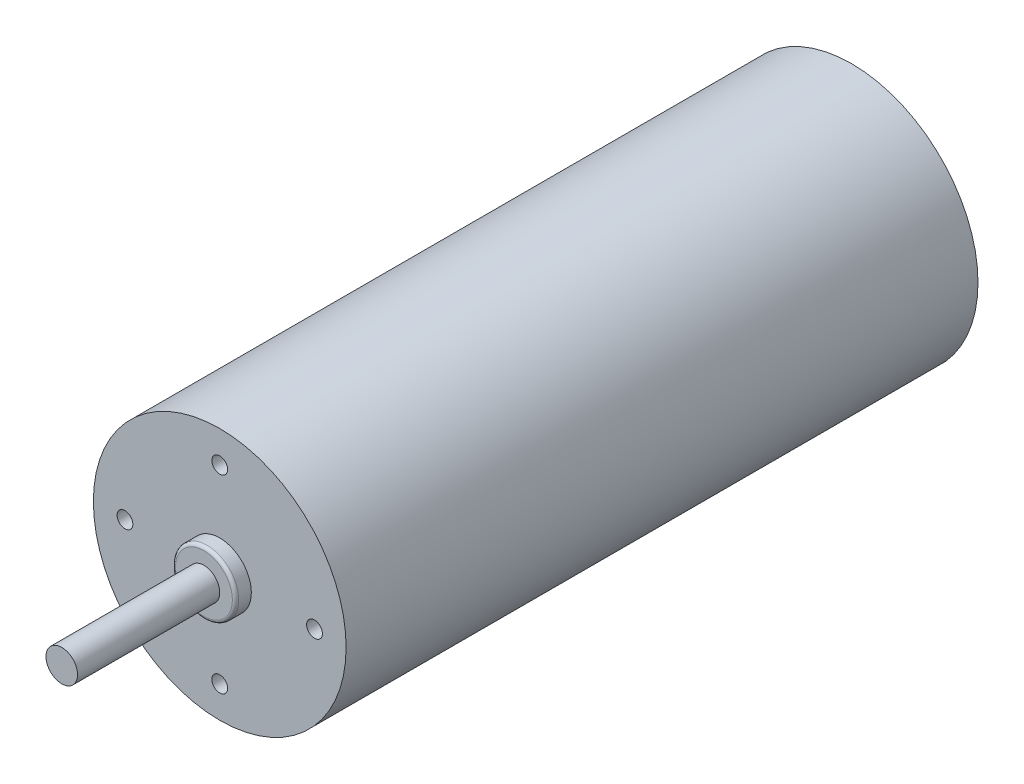
ISO-10303-21;
HEADER;
FILE_DESCRIPTION(('STEP AP214'),'2;1');
FILE_NAME('part.step','',(''),(''),'','','');
FILE_SCHEMA(('AUTOMOTIVE_DESIGN { 1 0 10303 214 1 1 1 1 }'));
ENDSEC;
DATA;
#1=APPLICATION_CONTEXT('core data for automotive mechanical design processes');
#2=APPLICATION_PROTOCOL_DEFINITION('international standard','automotive_design',2000,#1);
#3=PRODUCT_CONTEXT('',#1,'mechanical');
#4=PRODUCT('Part','Part','',(#3));
#5=PRODUCT_RELATED_PRODUCT_CATEGORY('part','',(#4));
#6=PRODUCT_DEFINITION_FORMATION('','',#4);
#7=PRODUCT_DEFINITION_CONTEXT('part definition',#1,'design');
#8=PRODUCT_DEFINITION('design','',#6,#7);
#9=PRODUCT_DEFINITION_SHAPE('','',#8);
#10=(LENGTH_UNIT() NAMED_UNIT(*) SI_UNIT(.MILLI.,.METRE.));
#11=(NAMED_UNIT(*) PLANE_ANGLE_UNIT() SI_UNIT($,.RADIAN.));
#12=(NAMED_UNIT(*) SI_UNIT($,.STERADIAN.) SOLID_ANGLE_UNIT());
#13=UNCERTAINTY_MEASURE_WITH_UNIT(LENGTH_MEASURE(1.E-05),#10,'distance_accuracy_value','');
#14=(GEOMETRIC_REPRESENTATION_CONTEXT(3) GLOBAL_UNCERTAINTY_ASSIGNED_CONTEXT((#13)) GLOBAL_UNIT_ASSIGNED_CONTEXT((#10,
#11,#12)) REPRESENTATION_CONTEXT('',''));
#15=CARTESIAN_POINT('',(0.,0.,0.));
#16=DIRECTION('',(0.,0.,1.));
#17=DIRECTION('',(1.,0.,0.));
#18=AXIS2_PLACEMENT_3D('',#15,#16,#17);
#19=CARTESIAN_POINT('',(0.,0.,20.));
#20=DIRECTION('',(0.,0.,-1.));
#21=DIRECTION('',(-1.,0.,0.));
#22=AXIS2_PLACEMENT_3D('',#19,#20,#21);
#23=CYLINDRICAL_SURFACE('',#22,4.);
#24=CARTESIAN_POINT('',(0.,0.,20.));
#25=DIRECTION('',(0.,0.,1.));
#26=DIRECTION('',(1.,0.,0.));
#27=AXIS2_PLACEMENT_3D('',#24,#25,#26);
#28=CIRCLE('',#27,4.);
#29=CARTESIAN_POINT('',(4.,0.,20.));
#30=VERTEX_POINT('',#29);
#31=EDGE_CURVE('E45',#30,#30,#28,.T.);
#32=ORIENTED_EDGE('',*,*,#31,.F.);
#33=EDGE_LOOP('',(#32));
#34=FACE_BOUND('',#33,.T.);
#35=CARTESIAN_POINT('',(0.,0.,0.));
#36=DIRECTION('',(0.,0.,1.));
#37=DIRECTION('',(1.,0.,0.));
#38=AXIS2_PLACEMENT_3D('',#35,#36,#37);
#39=CIRCLE('',#38,4.);
#40=CARTESIAN_POINT('',(4.,0.,0.));
#41=VERTEX_POINT('',#40);
#42=EDGE_CURVE('E48',#41,#41,#39,.T.);
#43=ORIENTED_EDGE('',*,*,#42,.T.);
#44=EDGE_LOOP('',(#43));
#45=FACE_BOUND('',#44,.T.);
#46=ADVANCED_FACE('F30',(#34,#45),#23,.T.);
#47=CARTESIAN_POINT('',(0.,0.,20.));
#48=DIRECTION('',(0.,0.,1.));
#49=DIRECTION('',(1.,0.,0.));
#50=AXIS2_PLACEMENT_3D('',#47,#48,#49);
#51=PLANE('',#50);
#52=CARTESIAN_POINT('',(0.,3.,20.));
#53=DIRECTION('',(0.,0.,1.));
#54=DIRECTION('',(1.,0.,0.));
#55=AXIS2_PLACEMENT_3D('',#52,#53,#54);
#56=CIRCLE('',#55,0.25);
#57=CARTESIAN_POINT('',(0.25,3.,20.));
#58=VERTEX_POINT('',#57);
#59=EDGE_CURVE('E78',#58,#58,#56,.T.);
#60=ORIENTED_EDGE('',*,*,#59,.F.);
#61=EDGE_LOOP('',(#60));
#62=FACE_BOUND('',#61,.T.);
#63=CARTESIAN_POINT('',(0.,-3.,20.));
#64=DIRECTION('',(0.,0.,1.));
#65=DIRECTION('',(-1.,0.,0.));
#66=AXIS2_PLACEMENT_3D('',#63,#64,#65);
#67=CIRCLE('',#66,0.25);
#68=CARTESIAN_POINT('',(-0.249999999999999,-3.,20.));
#69=VERTEX_POINT('',#68);
#70=EDGE_CURVE('E72',#69,#69,#67,.T.);
#71=ORIENTED_EDGE('',*,*,#70,.F.);
#72=EDGE_LOOP('',(#71));
#73=FACE_BOUND('',#72,.T.);
#74=CARTESIAN_POINT('',(3.,0.,20.));
#75=DIRECTION('',(0.,0.,1.));
#76=DIRECTION('',(1.,0.,0.));
#77=AXIS2_PLACEMENT_3D('',#74,#75,#76);
#78=CIRCLE('',#77,0.25);
#79=CARTESIAN_POINT('',(3.25,0.,20.));
#80=VERTEX_POINT('',#79);
#81=EDGE_CURVE('E66',#80,#80,#78,.T.);
#82=ORIENTED_EDGE('',*,*,#81,.F.);
#83=EDGE_LOOP('',(#82));
#84=FACE_BOUND('',#83,.T.);
#85=CARTESIAN_POINT('',(-3.,0.,20.));
#86=DIRECTION('',(0.,0.,1.));
#87=DIRECTION('',(-1.,0.,0.));
#88=AXIS2_PLACEMENT_3D('',#85,#86,#87);
#89=CIRCLE('',#88,0.25);
#90=CARTESIAN_POINT('',(-3.25,0.,20.));
#91=VERTEX_POINT('',#90);
#92=EDGE_CURVE('E60',#91,#91,#89,.T.);
#93=ORIENTED_EDGE('',*,*,#92,.F.);
#94=EDGE_LOOP('',(#93));
#95=FACE_BOUND('',#94,.T.);
#96=CARTESIAN_POINT('',(0.,0.,20.));
#97=DIRECTION('',(0.,0.,1.));
#98=DIRECTION('',(1.,0.,0.));
#99=AXIS2_PLACEMENT_3D('',#96,#97,#98);
#100=CIRCLE('',#99,1.);
#101=CARTESIAN_POINT('',(1.,0.,20.));
#102=VERTEX_POINT('',#101);
#103=EDGE_CURVE('E41',#102,#102,#100,.T.);
#104=ORIENTED_EDGE('',*,*,#103,.F.);
#105=EDGE_LOOP('',(#104));
#106=FACE_BOUND('',#105,.T.);
#107=ORIENTED_EDGE('',*,*,#31,.T.);
#108=EDGE_LOOP('',(#107));
#109=FACE_BOUND('',#108,.T.);
#110=ADVANCED_FACE('F94',(#62,#73,#84,#95,#106,#109),#51,.T.);
#111=CARTESIAN_POINT('',(0.,0.,0.));
#112=DIRECTION('',(0.,0.,1.));
#113=DIRECTION('',(1.,0.,0.));
#114=AXIS2_PLACEMENT_3D('',#111,#112,#113);
#115=PLANE('',#114);
#116=CARTESIAN_POINT('',(0.,3.,0.));
#117=DIRECTION('',(0.,0.,1.));
#118=DIRECTION('',(1.,0.,0.));
#119=AXIS2_PLACEMENT_3D('',#116,#117,#118);
#120=CIRCLE('',#119,0.25);
#121=CARTESIAN_POINT('',(0.25,3.,0.));
#122=VERTEX_POINT('',#121);
#123=EDGE_CURVE('E59',#122,#122,#120,.T.);
#124=ORIENTED_EDGE('',*,*,#123,.T.);
#125=EDGE_LOOP('',(#124));
#126=FACE_BOUND('',#125,.T.);
#127=CARTESIAN_POINT('',(0.,-3.,0.));
#128=DIRECTION('',(0.,0.,1.));
#129=DIRECTION('',(-1.,0.,0.));
#130=AXIS2_PLACEMENT_3D('',#127,#128,#129);
#131=CIRCLE('',#130,0.25);
#132=CARTESIAN_POINT('',(-0.249999999999999,-3.,0.));
#133=VERTEX_POINT('',#132);
#134=EDGE_CURVE('E75',#133,#133,#131,.T.);
#135=ORIENTED_EDGE('',*,*,#134,.T.);
#136=EDGE_LOOP('',(#135));
#137=FACE_BOUND('',#136,.T.);
#138=CARTESIAN_POINT('',(3.,0.,0.));
#139=DIRECTION('',(0.,0.,1.));
#140=DIRECTION('',(1.,0.,0.));
#141=AXIS2_PLACEMENT_3D('',#138,#139,#140);
#142=CIRCLE('',#141,0.25);
#143=CARTESIAN_POINT('',(3.25,0.,0.));
#144=VERTEX_POINT('',#143);
#145=EDGE_CURVE('E69',#144,#144,#142,.T.);
#146=ORIENTED_EDGE('',*,*,#145,.T.);
#147=EDGE_LOOP('',(#146));
#148=FACE_BOUND('',#147,.T.);
#149=CARTESIAN_POINT('',(-3.,0.,0.));
#150=DIRECTION('',(0.,0.,1.));
#151=DIRECTION('',(-1.,0.,0.));
#152=AXIS2_PLACEMENT_3D('',#149,#150,#151);
#153=CIRCLE('',#152,0.25);
#154=CARTESIAN_POINT('',(-3.25,0.,0.));
#155=VERTEX_POINT('',#154);
#156=EDGE_CURVE('E63',#155,#155,#153,.T.);
#157=ORIENTED_EDGE('',*,*,#156,.T.);
#158=EDGE_LOOP('',(#157));
#159=FACE_BOUND('',#158,.T.);
#160=ORIENTED_EDGE('',*,*,#42,.F.);
#161=EDGE_LOOP('',(#160));
#162=FACE_BOUND('',#161,.T.);
#163=ADVANCED_FACE('F84',(#126,#137,#148,#159,#162),#115,.F.);
#164=CARTESIAN_POINT('',(0.,0.,20.5));
#165=DIRECTION('',(0.,0.,1.));
#166=DIRECTION('',(1.,0.,0.));
#167=AXIS2_PLACEMENT_3D('',#164,#165,#166);
#168=PLANE('',#167);
#169=CARTESIAN_POINT('',(0.,0.,20.5));
#170=DIRECTION('',(0.,0.,1.));
#171=DIRECTION('',(1.,0.,0.));
#172=AXIS2_PLACEMENT_3D('',#169,#170,#171);
#173=CIRCLE('',#172,0.9);
#174=CARTESIAN_POINT('',(0.9,0.,20.5));
#175=VERTEX_POINT('',#174);
#176=EDGE_CURVE('E37',#175,#175,#173,.T.);
#177=ORIENTED_EDGE('',*,*,#176,.T.);
#178=EDGE_LOOP('',(#177));
#179=FACE_BOUND('',#178,.T.);
#180=CARTESIAN_POINT('',(0.,0.,20.5));
#181=DIRECTION('',(0.,0.,1.));
#182=DIRECTION('',(1.,0.,0.));
#183=AXIS2_PLACEMENT_3D('',#180,#181,#182);
#184=CIRCLE('',#183,0.5);
#185=CARTESIAN_POINT('',(0.5,0.,20.5));
#186=VERTEX_POINT('',#185);
#187=EDGE_CURVE('E51',#186,#186,#184,.T.);
#188=ORIENTED_EDGE('',*,*,#187,.F.);
#189=EDGE_LOOP('',(#188));
#190=FACE_BOUND('',#189,.T.);
#191=ADVANCED_FACE('F113',(#179,#190),#168,.T.);
#192=CARTESIAN_POINT('',(0.,0.,20.5));
#193=DIRECTION('',(0.,0.,-1.));
#194=DIRECTION('',(-1.,0.,0.));
#195=AXIS2_PLACEMENT_3D('',#192,#193,#194);
#196=CYLINDRICAL_SURFACE('',#195,1.);
#197=CARTESIAN_POINT('',(0.,0.,20.4));
#198=DIRECTION('',(0.,0.,1.));
#199=DIRECTION('',(1.,0.,0.));
#200=AXIS2_PLACEMENT_3D('',#197,#198,#199);
#201=CIRCLE('',#200,1.);
#202=CARTESIAN_POINT('',(1.,0.,20.4));
#203=VERTEX_POINT('',#202);
#204=EDGE_CURVE('E10',#203,#203,#201,.F.);
#205=ORIENTED_EDGE('',*,*,#204,.T.);
#206=EDGE_LOOP('',(#205));
#207=FACE_BOUND('',#206,.T.);
#208=ORIENTED_EDGE('',*,*,#103,.T.);
#209=EDGE_LOOP('',(#208));
#210=FACE_BOUND('',#209,.T.);
#211=ADVANCED_FACE('F118',(#207,#210),#196,.T.);
#212=CARTESIAN_POINT('',(0.,0.,25.));
#213=DIRECTION('',(0.,0.,-1.));
#214=DIRECTION('',(-1.,0.,0.));
#215=AXIS2_PLACEMENT_3D('',#212,#213,#214);
#216=CYLINDRICAL_SURFACE('',#215,0.5);
#217=ORIENTED_EDGE('',*,*,#187,.T.);
#218=EDGE_LOOP('',(#217));
#219=FACE_BOUND('',#218,.T.);
#220=CARTESIAN_POINT('',(0.,0.,25.));
#221=DIRECTION('',(0.,0.,1.));
#222=DIRECTION('',(1.,0.,0.));
#223=AXIS2_PLACEMENT_3D('',#220,#221,#222);
#224=CIRCLE('',#223,0.5);
#225=CARTESIAN_POINT('',(0.5,0.,25.));
#226=VERTEX_POINT('',#225);
#227=EDGE_CURVE('E56',#226,#226,#224,.T.);
#228=ORIENTED_EDGE('',*,*,#227,.F.);
#229=EDGE_LOOP('',(#228));
#230=FACE_BOUND('',#229,.T.);
#231=ADVANCED_FACE('F122',(#219,#230),#216,.T.);
#232=CARTESIAN_POINT('',(0.,0.,25.));
#233=DIRECTION('',(0.,0.,1.));
#234=DIRECTION('',(1.,0.,0.));
#235=AXIS2_PLACEMENT_3D('',#232,#233,#234);
#236=PLANE('',#235);
#237=ORIENTED_EDGE('',*,*,#227,.T.);
#238=EDGE_LOOP('',(#237));
#239=FACE_BOUND('',#238,.T.);
#240=ADVANCED_FACE('F126',(#239),#236,.T.);
#241=CARTESIAN_POINT('',(0.,0.,20.4));
#242=DIRECTION('',(0.,0.,1.));
#243=DIRECTION('',(1.,0.,0.));
#244=AXIS2_PLACEMENT_3D('',#241,#242,#243);
#245=TOROIDAL_SURFACE('',#244,0.9,0.1);
#246=ORIENTED_EDGE('',*,*,#204,.F.);
#247=EDGE_LOOP('',(#246));
#248=FACE_BOUND('',#247,.T.);
#249=ORIENTED_EDGE('',*,*,#176,.F.);
#250=EDGE_LOOP('',(#249));
#251=FACE_BOUND('',#250,.T.);
#252=ADVANCED_FACE('F32',(#248,#251),#245,.T.);
#253=CARTESIAN_POINT('',(-3.,0.,0.));
#254=DIRECTION('',(0.,0.,1.));
#255=DIRECTION('',(1.,0.,0.));
#256=AXIS2_PLACEMENT_3D('',#253,#254,#255);
#257=CYLINDRICAL_SURFACE('',#256,0.25);
#258=ORIENTED_EDGE('',*,*,#156,.F.);
#259=EDGE_LOOP('',(#258));
#260=FACE_BOUND('',#259,.T.);
#261=ORIENTED_EDGE('',*,*,#92,.T.);
#262=EDGE_LOOP('',(#261));
#263=FACE_BOUND('',#262,.T.);
#264=ADVANCED_FACE('F131',(#260,#263),#257,.F.);
#265=CARTESIAN_POINT('',(3.,0.,0.));
#266=DIRECTION('',(0.,0.,1.));
#267=DIRECTION('',(1.,0.,0.));
#268=AXIS2_PLACEMENT_3D('',#265,#266,#267);
#269=CYLINDRICAL_SURFACE('',#268,0.25);
#270=ORIENTED_EDGE('',*,*,#145,.F.);
#271=EDGE_LOOP('',(#270));
#272=FACE_BOUND('',#271,.T.);
#273=ORIENTED_EDGE('',*,*,#81,.T.);
#274=EDGE_LOOP('',(#273));
#275=FACE_BOUND('',#274,.T.);
#276=ADVANCED_FACE('F134',(#272,#275),#269,.F.);
#277=CARTESIAN_POINT('',(0.,-3.,0.));
#278=DIRECTION('',(0.,0.,1.));
#279=DIRECTION('',(1.,0.,0.));
#280=AXIS2_PLACEMENT_3D('',#277,#278,#279);
#281=CYLINDRICAL_SURFACE('',#280,0.25);
#282=ORIENTED_EDGE('',*,*,#134,.F.);
#283=EDGE_LOOP('',(#282));
#284=FACE_BOUND('',#283,.T.);
#285=ORIENTED_EDGE('',*,*,#70,.T.);
#286=EDGE_LOOP('',(#285));
#287=FACE_BOUND('',#286,.T.);
#288=ADVANCED_FACE('F90',(#284,#287),#281,.F.);
#289=CARTESIAN_POINT('',(0.,3.,0.));
#290=DIRECTION('',(0.,0.,1.));
#291=DIRECTION('',(1.,0.,0.));
#292=AXIS2_PLACEMENT_3D('',#289,#290,#291);
#293=CYLINDRICAL_SURFACE('',#292,0.25);
#294=ORIENTED_EDGE('',*,*,#123,.F.);
#295=EDGE_LOOP('',(#294));
#296=FACE_BOUND('',#295,.T.);
#297=ORIENTED_EDGE('',*,*,#59,.T.);
#298=EDGE_LOOP('',(#297));
#299=FACE_BOUND('',#298,.T.);
#300=ADVANCED_FACE('F87',(#296,#299),#293,.F.);
#301=CLOSED_SHELL('',(#46,#110,#163,#191,#211,#231,#240,#252,#264,#276,#288,#300));
#302=MANIFOLD_SOLID_BREP('B2',#301);
#303=ADVANCED_BREP_SHAPE_REPRESENTATION('',(#18,#302),#14);
#304=SHAPE_DEFINITION_REPRESENTATION(#9,#303);
ENDSEC;
END-ISO-10303-21;
